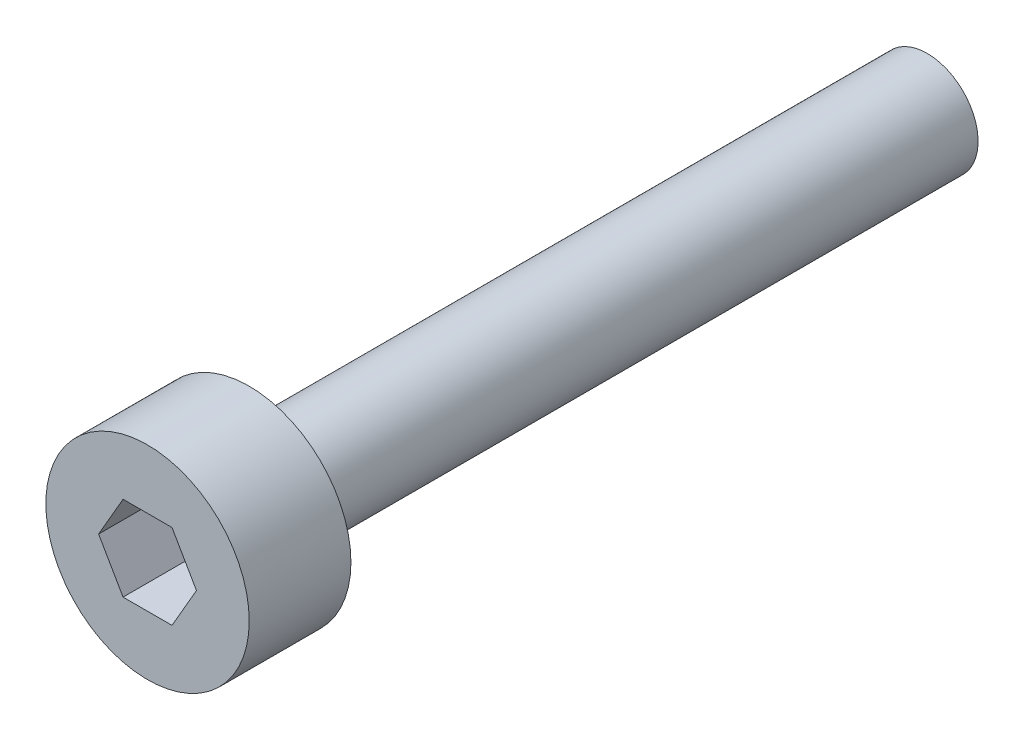
ISO-10303-21;
HEADER;
FILE_DESCRIPTION(('STEP AP214'),'2;1');
FILE_NAME('part.step','',(''),(''),'','','');
FILE_SCHEMA(('AUTOMOTIVE_DESIGN { 1 0 10303 214 1 1 1 1 }'));
ENDSEC;
DATA;
#1=APPLICATION_CONTEXT('core data for automotive mechanical design processes');
#2=APPLICATION_PROTOCOL_DEFINITION('international standard','automotive_design',2000,#1);
#3=PRODUCT_CONTEXT('',#1,'mechanical');
#4=PRODUCT('Part','Part','',(#3));
#5=PRODUCT_RELATED_PRODUCT_CATEGORY('part','',(#4));
#6=PRODUCT_DEFINITION_FORMATION('','',#4);
#7=PRODUCT_DEFINITION_CONTEXT('part definition',#1,'design');
#8=PRODUCT_DEFINITION('design','',#6,#7);
#9=PRODUCT_DEFINITION_SHAPE('','',#8);
#10=(LENGTH_UNIT() NAMED_UNIT(*) SI_UNIT(.MILLI.,.METRE.));
#11=(NAMED_UNIT(*) PLANE_ANGLE_UNIT() SI_UNIT($,.RADIAN.));
#12=(NAMED_UNIT(*) SI_UNIT($,.STERADIAN.) SOLID_ANGLE_UNIT());
#13=UNCERTAINTY_MEASURE_WITH_UNIT(LENGTH_MEASURE(1.E-05),#10,'distance_accuracy_value','');
#14=(GEOMETRIC_REPRESENTATION_CONTEXT(3) GLOBAL_UNCERTAINTY_ASSIGNED_CONTEXT((#13)) GLOBAL_UNIT_ASSIGNED_CONTEXT((#10,
#11,#12)) REPRESENTATION_CONTEXT('',''));
#15=CARTESIAN_POINT('',(0.,0.,0.));
#16=DIRECTION('',(0.,0.,1.));
#17=DIRECTION('',(1.,0.,0.));
#18=AXIS2_PLACEMENT_3D('',#15,#16,#17);
#19=CARTESIAN_POINT('',(0.,0.,3.));
#20=DIRECTION('',(0.,0.,-1.));
#21=DIRECTION('',(-1.,0.,0.));
#22=AXIS2_PLACEMENT_3D('',#19,#20,#21);
#23=CYLINDRICAL_SURFACE('',#22,3.);
#24=CARTESIAN_POINT('',(0.,0.,3.));
#25=DIRECTION('',(0.,0.,1.));
#26=DIRECTION('',(1.,0.,0.));
#27=AXIS2_PLACEMENT_3D('',#24,#25,#26);
#28=CIRCLE('',#27,3.);
#29=CARTESIAN_POINT('',(3.,0.,3.));
#30=VERTEX_POINT('',#29);
#31=EDGE_CURVE('E54',#30,#30,#28,.T.);
#32=ORIENTED_EDGE('',*,*,#31,.F.);
#33=EDGE_LOOP('',(#32));
#34=FACE_BOUND('',#33,.T.);
#35=CARTESIAN_POINT('',(0.,0.,0.));
#36=DIRECTION('',(0.,0.,1.));
#37=DIRECTION('',(1.,0.,0.));
#38=AXIS2_PLACEMENT_3D('',#35,#36,#37);
#39=CIRCLE('',#38,3.);
#40=CARTESIAN_POINT('',(3.,0.,0.));
#41=VERTEX_POINT('',#40);
#42=EDGE_CURVE('E48',#41,#41,#39,.T.);
#43=ORIENTED_EDGE('',*,*,#42,.T.);
#44=EDGE_LOOP('',(#43));
#45=FACE_BOUND('',#44,.T.);
#46=ADVANCED_FACE('F45',(#34,#45),#23,.T.);
#47=CARTESIAN_POINT('',(0.,0.,3.));
#48=DIRECTION('',(0.,0.,1.));
#49=DIRECTION('',(1.,0.,0.));
#50=AXIS2_PLACEMENT_3D('',#47,#48,#49);
#51=PLANE('',#50);
#52=DIRECTION('',(0.5,0.866025403784439,0.));
#53=VECTOR('',#52,1.);
#54=CARTESIAN_POINT('',(0.721687836487033,-1.25,3.));
#55=LINE('',#54,#53);
#56=CARTESIAN_POINT('',(0.721687836487033,-1.25,3.));
#57=VERTEX_POINT('',#56);
#58=CARTESIAN_POINT('',(1.44337567297407,0.,3.));
#59=VERTEX_POINT('',#58);
#60=EDGE_CURVE('E62',#57,#59,#55,.T.);
#61=ORIENTED_EDGE('',*,*,#60,.F.);
#62=DIRECTION('',(1.,0.,0.));
#63=VECTOR('',#62,1.);
#64=CARTESIAN_POINT('',(-0.721687836487031,-1.25,3.));
#65=LINE('',#64,#63);
#66=CARTESIAN_POINT('',(-0.721687836487031,-1.25,3.));
#67=VERTEX_POINT('',#66);
#68=EDGE_CURVE('E156',#67,#57,#65,.T.);
#69=ORIENTED_EDGE('',*,*,#68,.F.);
#70=DIRECTION('',(0.5,-0.866025403784438,0.));
#71=VECTOR('',#70,1.);
#72=CARTESIAN_POINT('',(-1.44337567297406,0.,3.));
#73=LINE('',#72,#71);
#74=CARTESIAN_POINT('',(-1.44337567297406,0.,3.));
#75=VERTEX_POINT('',#74);
#76=EDGE_CURVE('E153',#75,#67,#73,.T.);
#77=ORIENTED_EDGE('',*,*,#76,.F.);
#78=DIRECTION('',(-0.5,-0.866025403784439,0.));
#79=VECTOR('',#78,1.);
#80=CARTESIAN_POINT('',(-0.721687836487032,1.25,3.));
#81=LINE('',#80,#79);
#82=CARTESIAN_POINT('',(-0.721687836487032,1.25,3.));
#83=VERTEX_POINT('',#82);
#84=EDGE_CURVE('E110',#83,#75,#81,.T.);
#85=ORIENTED_EDGE('',*,*,#84,.F.);
#86=DIRECTION('',(-1.,0.,0.));
#87=VECTOR('',#86,1.);
#88=CARTESIAN_POINT('',(0.721687836487032,1.25,3.));
#89=LINE('',#88,#87);
#90=CARTESIAN_POINT('',(0.721687836487032,1.25,3.));
#91=VERTEX_POINT('',#90);
#92=EDGE_CURVE('E147',#91,#83,#89,.T.);
#93=ORIENTED_EDGE('',*,*,#92,.F.);
#94=DIRECTION('',(-0.5,0.866025403784438,0.));
#95=VECTOR('',#94,1.);
#96=CARTESIAN_POINT('',(1.44337567297406,0.,3.));
#97=LINE('',#96,#95);
#98=EDGE_CURVE('E142',#59,#91,#97,.T.);
#99=ORIENTED_EDGE('',*,*,#98,.F.);
#100=EDGE_LOOP('',(#61,#69,#77,#85,#93,#99));
#101=FACE_BOUND('',#100,.T.);
#102=ORIENTED_EDGE('',*,*,#31,.T.);
#103=EDGE_LOOP('',(#102));
#104=FACE_BOUND('',#103,.T.);
#105=ADVANCED_FACE('F182',(#101,#104),#51,.T.);
#106=CARTESIAN_POINT('',(0.,0.,0.));
#107=DIRECTION('',(0.,0.,1.));
#108=DIRECTION('',(1.,0.,0.));
#109=AXIS2_PLACEMENT_3D('',#106,#107,#108);
#110=PLANE('',#109);
#111=CARTESIAN_POINT('',(0.,0.,0.));
#112=DIRECTION('',(0.,0.,-1.));
#113=DIRECTION('',(-1.,0.,0.));
#114=AXIS2_PLACEMENT_3D('',#111,#112,#113);
#115=CIRCLE('',#114,1.5);
#116=CARTESIAN_POINT('',(-1.5,0.,0.));
#117=VERTEX_POINT('',#116);
#118=EDGE_CURVE('E11',#117,#117,#115,.T.);
#119=ORIENTED_EDGE('',*,*,#118,.F.);
#120=EDGE_LOOP('',(#119));
#121=FACE_BOUND('',#120,.T.);
#122=ORIENTED_EDGE('',*,*,#42,.F.);
#123=EDGE_LOOP('',(#122));
#124=FACE_BOUND('',#123,.T.);
#125=ADVANCED_FACE('F179',(#121,#124),#110,.F.);
#126=CARTESIAN_POINT('',(0.721687836487033,-1.25,1.));
#127=DIRECTION('',(0.866025403784439,-0.5,0.));
#128=DIRECTION('',(0.5,0.866025403784439,0.));
#129=AXIS2_PLACEMENT_3D('',#126,#127,#128);
#130=PLANE('',#129);
#131=ORIENTED_EDGE('',*,*,#60,.T.);
#132=DIRECTION('',(0.,0.,1.));
#133=VECTOR('',#132,1.);
#134=CARTESIAN_POINT('',(1.44337567297406,0.,1.));
#135=LINE('',#134,#133);
#136=CARTESIAN_POINT('',(1.44337567297406,0.,1.));
#137=VERTEX_POINT('',#136);
#138=EDGE_CURVE('E92',#137,#59,#135,.T.);
#139=ORIENTED_EDGE('',*,*,#138,.F.);
#140=DIRECTION('',(0.5,0.866025403784439,0.));
#141=VECTOR('',#140,1.);
#142=CARTESIAN_POINT('',(0.721687836487033,-1.25,1.));
#143=LINE('',#142,#141);
#144=CARTESIAN_POINT('',(0.721687836487033,-1.25,1.));
#145=VERTEX_POINT('',#144);
#146=EDGE_CURVE('E159',#145,#137,#143,.T.);
#147=ORIENTED_EDGE('',*,*,#146,.F.);
#148=DIRECTION('',(0.,0.,1.));
#149=VECTOR('',#148,1.);
#150=CARTESIAN_POINT('',(0.721687836487033,-1.25,1.));
#151=LINE('',#150,#149);
#152=EDGE_CURVE('E70',#145,#57,#151,.T.);
#153=ORIENTED_EDGE('',*,*,#152,.T.);
#154=EDGE_LOOP('',(#131,#139,#147,#153));
#155=FACE_BOUND('',#154,.T.);
#156=ADVANCED_FACE('F181',(#155),#130,.F.);
#157=CARTESIAN_POINT('',(-0.721687836487031,-1.25,1.));
#158=DIRECTION('',(0.,-1.,0.));
#159=DIRECTION('',(0.,0.,-1.));
#160=AXIS2_PLACEMENT_3D('',#157,#158,#159);
#161=PLANE('',#160);
#162=ORIENTED_EDGE('',*,*,#68,.T.);
#163=ORIENTED_EDGE('',*,*,#152,.F.);
#164=DIRECTION('',(1.,0.,0.));
#165=VECTOR('',#164,1.);
#166=CARTESIAN_POINT('',(-0.721687836487031,-1.25,1.));
#167=LINE('',#166,#165);
#168=CARTESIAN_POINT('',(-0.721687836487031,-1.25,1.));
#169=VERTEX_POINT('',#168);
#170=EDGE_CURVE('E124',#169,#145,#167,.T.);
#171=ORIENTED_EDGE('',*,*,#170,.F.);
#172=DIRECTION('',(0.,0.,1.));
#173=VECTOR('',#172,1.);
#174=CARTESIAN_POINT('',(-0.721687836487031,-1.25,1.));
#175=LINE('',#174,#173);
#176=EDGE_CURVE('E115',#169,#67,#175,.T.);
#177=ORIENTED_EDGE('',*,*,#176,.T.);
#178=EDGE_LOOP('',(#162,#163,#171,#177));
#179=FACE_BOUND('',#178,.T.);
#180=ADVANCED_FACE('F189',(#179),#161,.F.);
#181=CARTESIAN_POINT('',(-1.44337567297406,0.,1.));
#182=DIRECTION('',(-0.866025403784438,-0.5,0.));
#183=DIRECTION('',(0.5,-0.866025403784438,0.));
#184=AXIS2_PLACEMENT_3D('',#181,#182,#183);
#185=PLANE('',#184);
#186=ORIENTED_EDGE('',*,*,#76,.T.);
#187=ORIENTED_EDGE('',*,*,#176,.F.);
#188=DIRECTION('',(0.5,-0.866025403784438,0.));
#189=VECTOR('',#188,1.);
#190=CARTESIAN_POINT('',(-1.44337567297406,0.,1.));
#191=LINE('',#190,#189);
#192=CARTESIAN_POINT('',(-1.44337567297406,0.,1.));
#193=VERTEX_POINT('',#192);
#194=EDGE_CURVE('E119',#193,#169,#191,.T.);
#195=ORIENTED_EDGE('',*,*,#194,.F.);
#196=DIRECTION('',(0.,0.,1.));
#197=VECTOR('',#196,1.);
#198=CARTESIAN_POINT('',(-1.44337567297406,0.,1.));
#199=LINE('',#198,#197);
#200=EDGE_CURVE('E103',#193,#75,#199,.T.);
#201=ORIENTED_EDGE('',*,*,#200,.T.);
#202=EDGE_LOOP('',(#186,#187,#195,#201));
#203=FACE_BOUND('',#202,.T.);
#204=ADVANCED_FACE('F120',(#203),#185,.F.);
#205=CARTESIAN_POINT('',(-0.721687836487032,1.25,1.));
#206=DIRECTION('',(-0.866025403784439,0.5,0.));
#207=DIRECTION('',(-0.5,-0.866025403784439,0.));
#208=AXIS2_PLACEMENT_3D('',#205,#206,#207);
#209=PLANE('',#208);
#210=ORIENTED_EDGE('',*,*,#84,.T.);
#211=ORIENTED_EDGE('',*,*,#200,.F.);
#212=DIRECTION('',(-0.5,-0.866025403784439,0.));
#213=VECTOR('',#212,1.);
#214=CARTESIAN_POINT('',(-0.721687836487032,1.25,1.));
#215=LINE('',#214,#213);
#216=CARTESIAN_POINT('',(-0.721687836487032,1.25,1.));
#217=VERTEX_POINT('',#216);
#218=EDGE_CURVE('E107',#217,#193,#215,.T.);
#219=ORIENTED_EDGE('',*,*,#218,.F.);
#220=DIRECTION('',(0.,0.,1.));
#221=VECTOR('',#220,1.);
#222=CARTESIAN_POINT('',(-0.721687836487032,1.25,1.));
#223=LINE('',#222,#221);
#224=EDGE_CURVE('E116',#217,#83,#223,.T.);
#225=ORIENTED_EDGE('',*,*,#224,.T.);
#226=EDGE_LOOP('',(#210,#211,#219,#225));
#227=FACE_BOUND('',#226,.T.);
#228=ADVANCED_FACE('F105',(#227),#209,.F.);
#229=CARTESIAN_POINT('',(0.721687836487032,1.25,1.));
#230=DIRECTION('',(0.,1.,0.));
#231=DIRECTION('',(0.,0.,1.));
#232=AXIS2_PLACEMENT_3D('',#229,#230,#231);
#233=PLANE('',#232);
#234=ORIENTED_EDGE('',*,*,#92,.T.);
#235=ORIENTED_EDGE('',*,*,#224,.F.);
#236=DIRECTION('',(-1.,0.,0.));
#237=VECTOR('',#236,1.);
#238=CARTESIAN_POINT('',(0.721687836487032,1.25,1.));
#239=LINE('',#238,#237);
#240=CARTESIAN_POINT('',(0.721687836487032,1.25,1.));
#241=VERTEX_POINT('',#240);
#242=EDGE_CURVE('E130',#241,#217,#239,.T.);
#243=ORIENTED_EDGE('',*,*,#242,.F.);
#244=DIRECTION('',(0.,0.,1.));
#245=VECTOR('',#244,1.);
#246=CARTESIAN_POINT('',(0.721687836487032,1.25,1.));
#247=LINE('',#246,#245);
#248=EDGE_CURVE('E166',#241,#91,#247,.T.);
#249=ORIENTED_EDGE('',*,*,#248,.T.);
#250=EDGE_LOOP('',(#234,#235,#243,#249));
#251=FACE_BOUND('',#250,.T.);
#252=ADVANCED_FACE('F230',(#251),#233,.F.);
#253=CARTESIAN_POINT('',(1.44337567297406,0.,1.));
#254=DIRECTION('',(0.866025403784438,0.5,0.));
#255=DIRECTION('',(-0.5,0.866025403784438,0.));
#256=AXIS2_PLACEMENT_3D('',#253,#254,#255);
#257=PLANE('',#256);
#258=ORIENTED_EDGE('',*,*,#98,.T.);
#259=ORIENTED_EDGE('',*,*,#248,.F.);
#260=DIRECTION('',(-0.5,0.866025403784438,0.));
#261=VECTOR('',#260,1.);
#262=CARTESIAN_POINT('',(1.44337567297406,0.,1.));
#263=LINE('',#262,#261);
#264=EDGE_CURVE('E134',#137,#241,#263,.T.);
#265=ORIENTED_EDGE('',*,*,#264,.F.);
#266=ORIENTED_EDGE('',*,*,#138,.T.);
#267=EDGE_LOOP('',(#258,#259,#265,#266));
#268=FACE_BOUND('',#267,.T.);
#269=ADVANCED_FACE('F238',(#268),#257,.F.);
#270=CARTESIAN_POINT('',(0.,0.,1.));
#271=DIRECTION('',(0.,0.,1.));
#272=DIRECTION('',(1.,0.,0.));
#273=AXIS2_PLACEMENT_3D('',#270,#271,#272);
#274=PLANE('',#273);
#275=ORIENTED_EDGE('',*,*,#146,.T.);
#276=ORIENTED_EDGE('',*,*,#264,.T.);
#277=ORIENTED_EDGE('',*,*,#242,.T.);
#278=ORIENTED_EDGE('',*,*,#218,.T.);
#279=ORIENTED_EDGE('',*,*,#194,.T.);
#280=ORIENTED_EDGE('',*,*,#170,.T.);
#281=EDGE_LOOP('',(#275,#276,#277,#278,#279,#280));
#282=FACE_BOUND('',#281,.T.);
#283=ADVANCED_FACE('F127',(#282),#274,.T.);
#284=CARTESIAN_POINT('',(0.,0.,-20.));
#285=DIRECTION('',(0.,0.,1.));
#286=DIRECTION('',(1.,0.,0.));
#287=AXIS2_PLACEMENT_3D('',#284,#285,#286);
#288=CYLINDRICAL_SURFACE('',#287,1.5);
#289=CARTESIAN_POINT('',(0.,0.,-20.));
#290=DIRECTION('',(0.,0.,-1.));
#291=DIRECTION('',(-1.,0.,0.));
#292=AXIS2_PLACEMENT_3D('',#289,#290,#291);
#293=CIRCLE('',#292,1.5);
#294=CARTESIAN_POINT('',(-1.5,0.,-20.));
#295=VERTEX_POINT('',#294);
#296=EDGE_CURVE('E143',#295,#295,#293,.T.);
#297=ORIENTED_EDGE('',*,*,#296,.F.);
#298=EDGE_LOOP('',(#297));
#299=FACE_BOUND('',#298,.T.);
#300=ORIENTED_EDGE('',*,*,#118,.T.);
#301=EDGE_LOOP('',(#300));
#302=FACE_BOUND('',#301,.T.);
#303=ADVANCED_FACE('F253',(#299,#302),#288,.T.);
#304=CARTESIAN_POINT('',(0.,0.,-20.));
#305=DIRECTION('',(0.,0.,-1.));
#306=DIRECTION('',(-1.,0.,0.));
#307=AXIS2_PLACEMENT_3D('',#304,#305,#306);
#308=PLANE('',#307);
#309=ORIENTED_EDGE('',*,*,#296,.T.);
#310=EDGE_LOOP('',(#309));
#311=FACE_BOUND('',#310,.T.);
#312=ADVANCED_FACE('F264',(#311),#308,.T.);
#313=CLOSED_SHELL('',(#46,#105,#125,#156,#180,#204,#228,#252,#269,#283,#303,#312));
#314=MANIFOLD_SOLID_BREP('B2',#313);
#315=ADVANCED_BREP_SHAPE_REPRESENTATION('',(#18,#314),#14);
#316=SHAPE_DEFINITION_REPRESENTATION(#9,#315);
ENDSEC;
END-ISO-10303-21;
